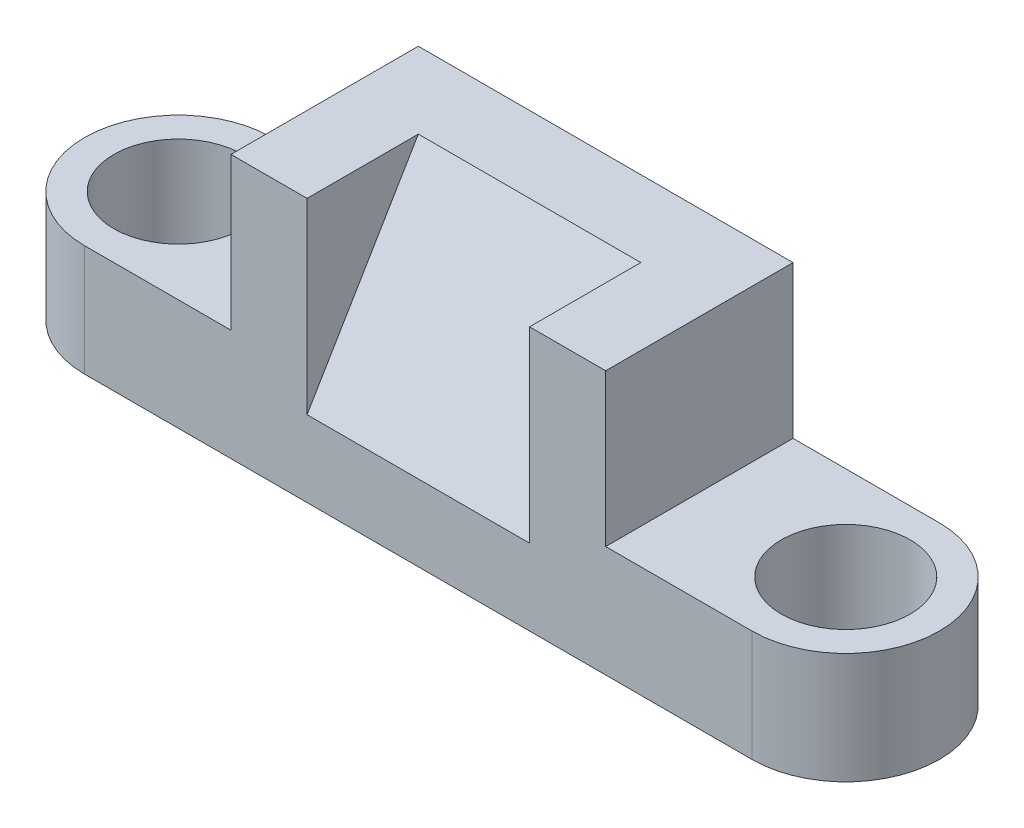
ISO-10303-21;
HEADER;
FILE_DESCRIPTION(('STEP AP214'),'2;1');
FILE_NAME('part.step','',(''),(''),'','','');
FILE_SCHEMA(('AUTOMOTIVE_DESIGN { 1 0 10303 214 1 1 1 1 }'));
ENDSEC;
DATA;
#1=APPLICATION_CONTEXT('core data for automotive mechanical design processes');
#2=APPLICATION_PROTOCOL_DEFINITION('international standard','automotive_design',2000,#1);
#3=PRODUCT_CONTEXT('',#1,'mechanical');
#4=PRODUCT('Part','Part','',(#3));
#5=PRODUCT_RELATED_PRODUCT_CATEGORY('part','',(#4));
#6=PRODUCT_DEFINITION_FORMATION('','',#4);
#7=PRODUCT_DEFINITION_CONTEXT('part definition',#1,'design');
#8=PRODUCT_DEFINITION('design','',#6,#7);
#9=PRODUCT_DEFINITION_SHAPE('','',#8);
#10=(LENGTH_UNIT() NAMED_UNIT(*) SI_UNIT(.MILLI.,.METRE.));
#11=(NAMED_UNIT(*) PLANE_ANGLE_UNIT() SI_UNIT($,.RADIAN.));
#12=(NAMED_UNIT(*) SI_UNIT($,.STERADIAN.) SOLID_ANGLE_UNIT());
#13=UNCERTAINTY_MEASURE_WITH_UNIT(LENGTH_MEASURE(1.E-05),#10,'distance_accuracy_value','');
#14=(GEOMETRIC_REPRESENTATION_CONTEXT(3) GLOBAL_UNCERTAINTY_ASSIGNED_CONTEXT((#13)) GLOBAL_UNIT_ASSIGNED_CONTEXT((#10,
#11,#12)) REPRESENTATION_CONTEXT('',''));
#15=CARTESIAN_POINT('',(0.,0.,0.));
#16=DIRECTION('',(0.,0.,1.));
#17=DIRECTION('',(1.,0.,0.));
#18=AXIS2_PLACEMENT_3D('',#15,#16,#17);
#19=CARTESIAN_POINT('',(13.,13.,-16.));
#20=DIRECTION('',(-1.,0.,0.));
#21=DIRECTION('',(0.,0.,1.));
#22=AXIS2_PLACEMENT_3D('',#19,#20,#21);
#23=PLANE('',#22);
#24=DIRECTION('',(0.,-0.859854743840735,0.510538754155436));
#25=VECTOR('',#24,1.);
#26=CARTESIAN_POINT('',(13.,13.,-16.));
#27=LINE('',#26,#25);
#28=CARTESIAN_POINT('',(13.,45.,-35.));
#29=VERTEX_POINT('',#28);
#30=CARTESIAN_POINT('',(13.,13.,-16.));
#31=VERTEX_POINT('',#30);
#32=EDGE_CURVE('E152',#29,#31,#27,.T.);
#33=ORIENTED_EDGE('',*,*,#32,.F.);
#34=DIRECTION('',(0.,0.,1.));
#35=VECTOR('',#34,1.);
#36=CARTESIAN_POINT('',(13.,45.,-16.));
#37=LINE('',#36,#35);
#38=CARTESIAN_POINT('',(13.,45.,-16.));
#39=VERTEX_POINT('',#38);
#40=EDGE_CURVE('E164',#29,#39,#37,.T.);
#41=ORIENTED_EDGE('',*,*,#40,.T.);
#42=DIRECTION('',(0.,1.,0.));
#43=VECTOR('',#42,1.);
#44=CARTESIAN_POINT('',(13.,13.,-16.));
#45=LINE('',#44,#43);
#46=EDGE_CURVE('E55',#31,#39,#45,.T.);
#47=ORIENTED_EDGE('',*,*,#46,.F.);
#48=EDGE_LOOP('',(#33,#41,#47));
#49=FACE_BOUND('',#48,.T.);
#50=ADVANCED_FACE('F39',(#49),#23,.F.);
#51=CARTESIAN_POINT('',(51.,13.,-16.));
#52=DIRECTION('',(1.,0.,0.));
#53=DIRECTION('',(0.,0.,-1.));
#54=AXIS2_PLACEMENT_3D('',#51,#52,#53);
#55=PLANE('',#54);
#56=DIRECTION('',(0.,0.859854743840735,-0.510538754155436));
#57=VECTOR('',#56,1.);
#58=CARTESIAN_POINT('',(51.,45.,-35.));
#59=LINE('',#58,#57);
#60=CARTESIAN_POINT('',(51.,13.,-16.));
#61=VERTEX_POINT('',#60);
#62=CARTESIAN_POINT('',(51.,45.,-35.));
#63=VERTEX_POINT('',#62);
#64=EDGE_CURVE('E145',#61,#63,#59,.T.);
#65=ORIENTED_EDGE('',*,*,#64,.F.);
#66=DIRECTION('',(0.,1.,0.));
#67=VECTOR('',#66,1.);
#68=CARTESIAN_POINT('',(51.,13.,-16.));
#69=LINE('',#68,#67);
#70=CARTESIAN_POINT('',(51.,45.,-16.));
#71=VERTEX_POINT('',#70);
#72=EDGE_CURVE('E131',#61,#71,#69,.T.);
#73=ORIENTED_EDGE('',*,*,#72,.T.);
#74=DIRECTION('',(0.,0.,-1.));
#75=VECTOR('',#74,1.);
#76=CARTESIAN_POINT('',(51.,45.,-16.));
#77=LINE('',#76,#75);
#78=EDGE_CURVE('E147',#71,#63,#77,.T.);
#79=ORIENTED_EDGE('',*,*,#78,.T.);
#80=EDGE_LOOP('',(#65,#73,#79));
#81=FACE_BOUND('',#80,.T.);
#82=ADVANCED_FACE('F146',(#81),#55,.F.);
#83=CARTESIAN_POINT('',(64.,45.,0.));
#84=DIRECTION('',(-1.,0.,0.));
#85=DIRECTION('',(0.,0.,1.));
#86=AXIS2_PLACEMENT_3D('',#83,#84,#85);
#87=PLANE('',#86);
#88=DIRECTION('',(0.,0.,1.));
#89=VECTOR('',#88,1.);
#90=CARTESIAN_POINT('',(64.,19.,-48.));
#91=LINE('',#90,#89);
#92=CARTESIAN_POINT('',(64.,19.,-48.));
#93=VERTEX_POINT('',#92);
#94=CARTESIAN_POINT('',(64.,19.,-16.));
#95=VERTEX_POINT('',#94);
#96=EDGE_CURVE('E204',#93,#95,#91,.T.);
#97=ORIENTED_EDGE('',*,*,#96,.F.);
#98=DIRECTION('',(0.,1.,0.));
#99=VECTOR('',#98,1.);
#100=CARTESIAN_POINT('',(64.,-103.,-48.));
#101=LINE('',#100,#99);
#102=CARTESIAN_POINT('',(64.,45.,-48.));
#103=VERTEX_POINT('',#102);
#104=EDGE_CURVE('E172',#93,#103,#101,.T.);
#105=ORIENTED_EDGE('',*,*,#104,.T.);
#106=DIRECTION('',(0.,0.,-1.));
#107=VECTOR('',#106,1.);
#108=CARTESIAN_POINT('',(64.,45.,0.));
#109=LINE('',#108,#107);
#110=CARTESIAN_POINT('',(64.,45.,-16.));
#111=VERTEX_POINT('',#110);
#112=EDGE_CURVE('E11',#111,#103,#109,.T.);
#113=ORIENTED_EDGE('',*,*,#112,.F.);
#114=DIRECTION('',(0.,-1.,0.));
#115=VECTOR('',#114,1.);
#116=CARTESIAN_POINT('',(64.,45.,-16.));
#117=LINE('',#116,#115);
#118=EDGE_CURVE('E184',#111,#95,#117,.T.);
#119=ORIENTED_EDGE('',*,*,#118,.T.);
#120=EDGE_LOOP('',(#97,#105,#113,#119));
#121=FACE_BOUND('',#120,.T.);
#122=ADVANCED_FACE('F288',(#121),#87,.F.);
#123=CARTESIAN_POINT('',(0.,45.,0.));
#124=DIRECTION('',(1.,0.,0.));
#125=DIRECTION('',(0.,0.,-1.));
#126=AXIS2_PLACEMENT_3D('',#123,#124,#125);
#127=PLANE('',#126);
#128=DIRECTION('',(0.,0.,1.));
#129=VECTOR('',#128,1.);
#130=CARTESIAN_POINT('',(0.,45.,0.));
#131=LINE('',#130,#129);
#132=CARTESIAN_POINT('',(0.,45.,-48.));
#133=VERTEX_POINT('',#132);
#134=CARTESIAN_POINT('',(0.,45.,-16.));
#135=VERTEX_POINT('',#134);
#136=EDGE_CURVE('E48',#133,#135,#131,.T.);
#137=ORIENTED_EDGE('',*,*,#136,.F.);
#138=DIRECTION('',(0.,1.,0.));
#139=VECTOR('',#138,1.);
#140=CARTESIAN_POINT('',(0.,-103.,-48.));
#141=LINE('',#140,#139);
#142=CARTESIAN_POINT('',(0.,19.,-48.));
#143=VERTEX_POINT('',#142);
#144=EDGE_CURVE('E171',#143,#133,#141,.T.);
#145=ORIENTED_EDGE('',*,*,#144,.F.);
#146=DIRECTION('',(0.,0.,-1.));
#147=VECTOR('',#146,1.);
#148=CARTESIAN_POINT('',(0.,19.,-48.));
#149=LINE('',#148,#147);
#150=CARTESIAN_POINT('',(0.,19.,-16.));
#151=VERTEX_POINT('',#150);
#152=EDGE_CURVE('E235',#151,#143,#149,.T.);
#153=ORIENTED_EDGE('',*,*,#152,.F.);
#154=DIRECTION('',(0.,-1.,0.));
#155=VECTOR('',#154,1.);
#156=CARTESIAN_POINT('',(0.,0.,-16.));
#157=LINE('',#156,#155);
#158=EDGE_CURVE('E176',#135,#151,#157,.T.);
#159=ORIENTED_EDGE('',*,*,#158,.F.);
#160=EDGE_LOOP('',(#137,#145,#153,#159));
#161=FACE_BOUND('',#160,.T.);
#162=ADVANCED_FACE('F41',(#161),#127,.F.);
#163=CARTESIAN_POINT('',(0.,45.,0.));
#164=DIRECTION('',(0.,-1.,0.));
#165=DIRECTION('',(0.,0.,-1.));
#166=AXIS2_PLACEMENT_3D('',#163,#164,#165);
#167=PLANE('',#166);
#168=ORIENTED_EDGE('',*,*,#40,.F.);
#169=DIRECTION('',(-1.,0.,0.));
#170=VECTOR('',#169,1.);
#171=CARTESIAN_POINT('',(13.,45.,-35.));
#172=LINE('',#171,#170);
#173=EDGE_CURVE('E156',#63,#29,#172,.T.);
#174=ORIENTED_EDGE('',*,*,#173,.F.);
#175=ORIENTED_EDGE('',*,*,#78,.F.);
#176=DIRECTION('',(-1.,0.,0.));
#177=VECTOR('',#176,1.);
#178=CARTESIAN_POINT('',(148.,45.,-16.0000000000001));
#179=LINE('',#178,#177);
#180=EDGE_CURVE('E138',#111,#71,#179,.T.);
#181=ORIENTED_EDGE('',*,*,#180,.F.);
#182=ORIENTED_EDGE('',*,*,#112,.T.);
#183=DIRECTION('',(1.,0.,0.));
#184=VECTOR('',#183,1.);
#185=CARTESIAN_POINT('',(0.,45.,-48.));
#186=LINE('',#185,#184);
#187=EDGE_CURVE('E142',#133,#103,#186,.T.);
#188=ORIENTED_EDGE('',*,*,#187,.F.);
#189=ORIENTED_EDGE('',*,*,#136,.T.);
#190=EDGE_CURVE('E181',#39,#135,#179,.T.);
#191=ORIENTED_EDGE('',*,*,#190,.F.);
#192=EDGE_LOOP('',(#168,#174,#175,#181,#182,#188,#189,#191));
#193=FACE_BOUND('',#192,.T.);
#194=ADVANCED_FACE('F261',(#193),#167,.F.);
#195=CARTESIAN_POINT('',(0.,0.,0.));
#196=DIRECTION('',(0.,-1.,0.));
#197=DIRECTION('',(0.,0.,-1.));
#198=AXIS2_PLACEMENT_3D('',#195,#196,#197);
#199=PLANE('',#198);
#200=DIRECTION('',(-1.,0.,0.));
#201=VECTOR('',#200,1.);
#202=CARTESIAN_POINT('',(-25.,0.,-48.));
#203=LINE('',#202,#201);
#204=CARTESIAN_POINT('',(89.,0.,-48.));
#205=VERTEX_POINT('',#204);
#206=CARTESIAN_POINT('',(-25.,0.,-48.));
#207=VERTEX_POINT('',#206);
#208=EDGE_CURVE('E79',#205,#207,#203,.T.);
#209=ORIENTED_EDGE('',*,*,#208,.F.);
#210=CARTESIAN_POINT('',(89.,0.,-32.));
#211=DIRECTION('',(0.,1.,0.));
#212=DIRECTION('',(0.,0.,1.));
#213=AXIS2_PLACEMENT_3D('',#210,#211,#212);
#214=CIRCLE('',#213,16.);
#215=CARTESIAN_POINT('',(89.,0.,-16.));
#216=VERTEX_POINT('',#215);
#217=EDGE_CURVE('E192',#216,#205,#214,.T.);
#218=ORIENTED_EDGE('',*,*,#217,.F.);
#219=DIRECTION('',(1.,0.,0.));
#220=VECTOR('',#219,1.);
#221=CARTESIAN_POINT('',(-25.,0.,-16.));
#222=LINE('',#221,#220);
#223=CARTESIAN_POINT('',(-25.,0.,-16.));
#224=VERTEX_POINT('',#223);
#225=EDGE_CURVE('E244',#224,#216,#222,.T.);
#226=ORIENTED_EDGE('',*,*,#225,.F.);
#227=CARTESIAN_POINT('',(-25.,0.,-32.));
#228=DIRECTION('',(0.,1.,0.));
#229=DIRECTION('',(0.,0.,1.));
#230=AXIS2_PLACEMENT_3D('',#227,#228,#229);
#231=CIRCLE('',#230,16.);
#232=EDGE_CURVE('E226',#207,#224,#231,.T.);
#233=ORIENTED_EDGE('',*,*,#232,.F.);
#234=EDGE_LOOP('',(#209,#218,#226,#233));
#235=FACE_BOUND('',#234,.T.);
#236=CARTESIAN_POINT('',(-25.,0.,-32.));
#237=DIRECTION('',(0.,1.,0.));
#238=DIRECTION('',(0.,0.,1.));
#239=AXIS2_PLACEMENT_3D('',#236,#237,#238);
#240=CIRCLE('',#239,11.);
#241=CARTESIAN_POINT('',(-25.,0.,-21.));
#242=VERTEX_POINT('',#241);
#243=EDGE_CURVE('E221',#242,#242,#240,.T.);
#244=ORIENTED_EDGE('',*,*,#243,.T.);
#245=EDGE_LOOP('',(#244));
#246=FACE_BOUND('',#245,.T.);
#247=CARTESIAN_POINT('',(89.,0.,-32.));
#248=DIRECTION('',(0.,1.,0.));
#249=DIRECTION('',(0.,0.,1.));
#250=AXIS2_PLACEMENT_3D('',#247,#248,#249);
#251=CIRCLE('',#250,11.);
#252=CARTESIAN_POINT('',(89.,0.,-21.));
#253=VERTEX_POINT('',#252);
#254=EDGE_CURVE('E187',#253,#253,#251,.T.);
#255=ORIENTED_EDGE('',*,*,#254,.T.);
#256=EDGE_LOOP('',(#255));
#257=FACE_BOUND('',#256,.T.);
#258=ADVANCED_FACE('F279',(#235,#246,#257),#199,.T.);
#259=CARTESIAN_POINT('',(-25.,19.,-32.));
#260=DIRECTION('',(0.,1.,0.));
#261=DIRECTION('',(0.,0.,1.));
#262=AXIS2_PLACEMENT_3D('',#259,#260,#261);
#263=PLANE('',#262);
#264=CARTESIAN_POINT('',(-25.,19.,-32.));
#265=DIRECTION('',(0.,1.,0.));
#266=DIRECTION('',(0.,0.,1.));
#267=AXIS2_PLACEMENT_3D('',#264,#265,#266);
#268=CIRCLE('',#267,16.);
#269=CARTESIAN_POINT('',(-25.,19.,-48.));
#270=VERTEX_POINT('',#269);
#271=CARTESIAN_POINT('',(-25.,19.,-16.));
#272=VERTEX_POINT('',#271);
#273=EDGE_CURVE('E230',#270,#272,#268,.T.);
#274=ORIENTED_EDGE('',*,*,#273,.T.);
#275=DIRECTION('',(1.,0.,0.));
#276=VECTOR('',#275,1.);
#277=CARTESIAN_POINT('',(-25.,19.,-16.));
#278=LINE('',#277,#276);
#279=EDGE_CURVE('E85',#272,#151,#278,.T.);
#280=ORIENTED_EDGE('',*,*,#279,.T.);
#281=ORIENTED_EDGE('',*,*,#152,.T.);
#282=DIRECTION('',(-1.,0.,0.));
#283=VECTOR('',#282,1.);
#284=CARTESIAN_POINT('',(-25.,19.,-48.));
#285=LINE('',#284,#283);
#286=EDGE_CURVE('E64',#143,#270,#285,.T.);
#287=ORIENTED_EDGE('',*,*,#286,.T.);
#288=EDGE_LOOP('',(#274,#280,#281,#287));
#289=FACE_BOUND('',#288,.T.);
#290=CARTESIAN_POINT('',(-25.,19.,-32.));
#291=DIRECTION('',(0.,1.,0.));
#292=DIRECTION('',(0.,0.,1.));
#293=AXIS2_PLACEMENT_3D('',#290,#291,#292);
#294=CIRCLE('',#293,11.);
#295=CARTESIAN_POINT('',(-25.,19.,-21.));
#296=VERTEX_POINT('',#295);
#297=EDGE_CURVE('E222',#296,#296,#294,.T.);
#298=ORIENTED_EDGE('',*,*,#297,.F.);
#299=EDGE_LOOP('',(#298));
#300=FACE_BOUND('',#299,.T.);
#301=ADVANCED_FACE('F264',(#289,#300),#263,.T.);
#302=CARTESIAN_POINT('',(-25.,19.,-32.));
#303=DIRECTION('',(0.,-1.,0.));
#304=DIRECTION('',(0.,0.,-1.));
#305=AXIS2_PLACEMENT_3D('',#302,#303,#304);
#306=CYLINDRICAL_SURFACE('',#305,16.);
#307=ORIENTED_EDGE('',*,*,#232,.T.);
#308=DIRECTION('',(0.,-1.,0.));
#309=VECTOR('',#308,1.);
#310=CARTESIAN_POINT('',(-25.,19.,-16.));
#311=LINE('',#310,#309);
#312=EDGE_CURVE('E251',#272,#224,#311,.T.);
#313=ORIENTED_EDGE('',*,*,#312,.F.);
#314=ORIENTED_EDGE('',*,*,#273,.F.);
#315=DIRECTION('',(0.,-1.,0.));
#316=VECTOR('',#315,1.);
#317=CARTESIAN_POINT('',(-25.,19.,-48.));
#318=LINE('',#317,#316);
#319=EDGE_CURVE('E240',#270,#207,#318,.T.);
#320=ORIENTED_EDGE('',*,*,#319,.T.);
#321=EDGE_LOOP('',(#307,#313,#314,#320));
#322=FACE_BOUND('',#321,.T.);
#323=ADVANCED_FACE('F269',(#322),#306,.T.);
#324=CARTESIAN_POINT('',(-25.,19.,-16.));
#325=DIRECTION('',(0.,0.,-1.));
#326=DIRECTION('',(-1.,0.,0.));
#327=AXIS2_PLACEMENT_3D('',#324,#325,#326);
#328=PLANE('',#327);
#329=DIRECTION('',(1.,0.,0.));
#330=VECTOR('',#329,1.);
#331=CARTESIAN_POINT('',(13.,13.,-16.));
#332=LINE('',#331,#330);
#333=EDGE_CURVE('E135',#31,#61,#332,.T.);
#334=ORIENTED_EDGE('',*,*,#333,.F.);
#335=ORIENTED_EDGE('',*,*,#46,.T.);
#336=ORIENTED_EDGE('',*,*,#190,.T.);
#337=ORIENTED_EDGE('',*,*,#158,.T.);
#338=ORIENTED_EDGE('',*,*,#279,.F.);
#339=ORIENTED_EDGE('',*,*,#312,.T.);
#340=ORIENTED_EDGE('',*,*,#225,.T.);
#341=DIRECTION('',(0.,-1.,0.));
#342=VECTOR('',#341,1.);
#343=CARTESIAN_POINT('',(89.,19.,-16.));
#344=LINE('',#343,#342);
#345=CARTESIAN_POINT('',(89.,19.,-16.));
#346=VERTEX_POINT('',#345);
#347=EDGE_CURVE('E211',#346,#216,#344,.T.);
#348=ORIENTED_EDGE('',*,*,#347,.F.);
#349=DIRECTION('',(1.,0.,0.));
#350=VECTOR('',#349,1.);
#351=CARTESIAN_POINT('',(89.,19.,-16.));
#352=LINE('',#351,#350);
#353=EDGE_CURVE('E208',#95,#346,#352,.T.);
#354=ORIENTED_EDGE('',*,*,#353,.F.);
#355=ORIENTED_EDGE('',*,*,#118,.F.);
#356=ORIENTED_EDGE('',*,*,#180,.T.);
#357=ORIENTED_EDGE('',*,*,#72,.F.);
#358=EDGE_LOOP('',(#334,#335,#336,#337,#338,#339,#340,#348,#354,#355,#356,#357));
#359=FACE_BOUND('',#358,.T.);
#360=ADVANCED_FACE('F133',(#359),#328,.F.);
#361=CARTESIAN_POINT('',(-25.,19.,-48.));
#362=DIRECTION('',(0.,0.,1.));
#363=DIRECTION('',(1.,0.,0.));
#364=AXIS2_PLACEMENT_3D('',#361,#362,#363);
#365=PLANE('',#364);
#366=ORIENTED_EDGE('',*,*,#208,.T.);
#367=ORIENTED_EDGE('',*,*,#319,.F.);
#368=ORIENTED_EDGE('',*,*,#286,.F.);
#369=ORIENTED_EDGE('',*,*,#144,.T.);
#370=ORIENTED_EDGE('',*,*,#187,.T.);
#371=ORIENTED_EDGE('',*,*,#104,.F.);
#372=DIRECTION('',(-1.,0.,0.));
#373=VECTOR('',#372,1.);
#374=CARTESIAN_POINT('',(89.,19.,-48.));
#375=LINE('',#374,#373);
#376=CARTESIAN_POINT('',(89.,19.,-48.));
#377=VERTEX_POINT('',#376);
#378=EDGE_CURVE('E200',#377,#93,#375,.T.);
#379=ORIENTED_EDGE('',*,*,#378,.F.);
#380=DIRECTION('',(0.,-1.,0.));
#381=VECTOR('',#380,1.);
#382=CARTESIAN_POINT('',(89.,19.,-48.));
#383=LINE('',#382,#381);
#384=EDGE_CURVE('E218',#377,#205,#383,.T.);
#385=ORIENTED_EDGE('',*,*,#384,.T.);
#386=EDGE_LOOP('',(#366,#367,#368,#369,#370,#371,#379,#385));
#387=FACE_BOUND('',#386,.T.);
#388=ADVANCED_FACE('F281',(#387),#365,.F.);
#389=CARTESIAN_POINT('',(-25.,19.,-32.));
#390=DIRECTION('',(0.,-1.,0.));
#391=DIRECTION('',(0.,0.,-1.));
#392=AXIS2_PLACEMENT_3D('',#389,#390,#391);
#393=CYLINDRICAL_SURFACE('',#392,11.);
#394=ORIENTED_EDGE('',*,*,#297,.T.);
#395=EDGE_LOOP('',(#394));
#396=FACE_BOUND('',#395,.T.);
#397=ORIENTED_EDGE('',*,*,#243,.F.);
#398=EDGE_LOOP('',(#397));
#399=FACE_BOUND('',#398,.T.);
#400=ADVANCED_FACE('F308',(#396,#399),#393,.F.);
#401=CARTESIAN_POINT('',(89.,19.,-32.));
#402=DIRECTION('',(0.,1.,0.));
#403=DIRECTION('',(0.,0.,1.));
#404=AXIS2_PLACEMENT_3D('',#401,#402,#403);
#405=PLANE('',#404);
#406=CARTESIAN_POINT('',(89.,19.,-32.));
#407=DIRECTION('',(0.,1.,0.));
#408=DIRECTION('',(0.,0.,1.));
#409=AXIS2_PLACEMENT_3D('',#406,#407,#408);
#410=CIRCLE('',#409,16.);
#411=EDGE_CURVE('E196',#346,#377,#410,.T.);
#412=ORIENTED_EDGE('',*,*,#411,.T.);
#413=ORIENTED_EDGE('',*,*,#378,.T.);
#414=ORIENTED_EDGE('',*,*,#96,.T.);
#415=ORIENTED_EDGE('',*,*,#353,.T.);
#416=EDGE_LOOP('',(#412,#413,#414,#415));
#417=FACE_BOUND('',#416,.T.);
#418=CARTESIAN_POINT('',(89.,19.,-32.));
#419=DIRECTION('',(0.,1.,0.));
#420=DIRECTION('',(0.,0.,1.));
#421=AXIS2_PLACEMENT_3D('',#418,#419,#420);
#422=CIRCLE('',#421,11.);
#423=CARTESIAN_POINT('',(89.,19.,-21.));
#424=VERTEX_POINT('',#423);
#425=EDGE_CURVE('E188',#424,#424,#422,.T.);
#426=ORIENTED_EDGE('',*,*,#425,.F.);
#427=EDGE_LOOP('',(#426));
#428=FACE_BOUND('',#427,.T.);
#429=ADVANCED_FACE('F284',(#417,#428),#405,.T.);
#430=CARTESIAN_POINT('',(89.,19.,-32.));
#431=DIRECTION('',(0.,-1.,0.));
#432=DIRECTION('',(0.,0.,-1.));
#433=AXIS2_PLACEMENT_3D('',#430,#431,#432);
#434=CYLINDRICAL_SURFACE('',#433,16.);
#435=ORIENTED_EDGE('',*,*,#217,.T.);
#436=ORIENTED_EDGE('',*,*,#384,.F.);
#437=ORIENTED_EDGE('',*,*,#411,.F.);
#438=ORIENTED_EDGE('',*,*,#347,.T.);
#439=EDGE_LOOP('',(#435,#436,#437,#438));
#440=FACE_BOUND('',#439,.T.);
#441=ADVANCED_FACE('F277',(#440),#434,.T.);
#442=CARTESIAN_POINT('',(89.,19.,-32.));
#443=DIRECTION('',(0.,-1.,0.));
#444=DIRECTION('',(0.,0.,-1.));
#445=AXIS2_PLACEMENT_3D('',#442,#443,#444);
#446=CYLINDRICAL_SURFACE('',#445,11.);
#447=ORIENTED_EDGE('',*,*,#425,.T.);
#448=EDGE_LOOP('',(#447));
#449=FACE_BOUND('',#448,.T.);
#450=ORIENTED_EDGE('',*,*,#254,.F.);
#451=EDGE_LOOP('',(#450));
#452=FACE_BOUND('',#451,.T.);
#453=ADVANCED_FACE('F302',(#449,#452),#446,.F.);
#454=CARTESIAN_POINT('',(8.99999999999999,45.,-35.));
#455=DIRECTION('',(0.,-0.510538754155436,-0.859854743840735));
#456=DIRECTION('',(0.,0.859854743840735,-0.510538754155436));
#457=AXIS2_PLACEMENT_3D('',#454,#455,#456);
#458=PLANE('',#457);
#459=ORIENTED_EDGE('',*,*,#173,.T.);
#460=ORIENTED_EDGE('',*,*,#32,.T.);
#461=ORIENTED_EDGE('',*,*,#333,.T.);
#462=ORIENTED_EDGE('',*,*,#64,.T.);
#463=EDGE_LOOP('',(#459,#460,#461,#462));
#464=FACE_BOUND('',#463,.T.);
#465=ADVANCED_FACE('F154',(#464),#458,.F.);
#466=CLOSED_SHELL('',(#50,#82,#122,#162,#194,#258,#301,#323,#360,#388,#400,#429,#441,#453,#465));
#467=MANIFOLD_SOLID_BREP('B2',#466);
#468=ADVANCED_BREP_SHAPE_REPRESENTATION('',(#18,#467),#14);
#469=SHAPE_DEFINITION_REPRESENTATION(#9,#468);
ENDSEC;
END-ISO-10303-21;
